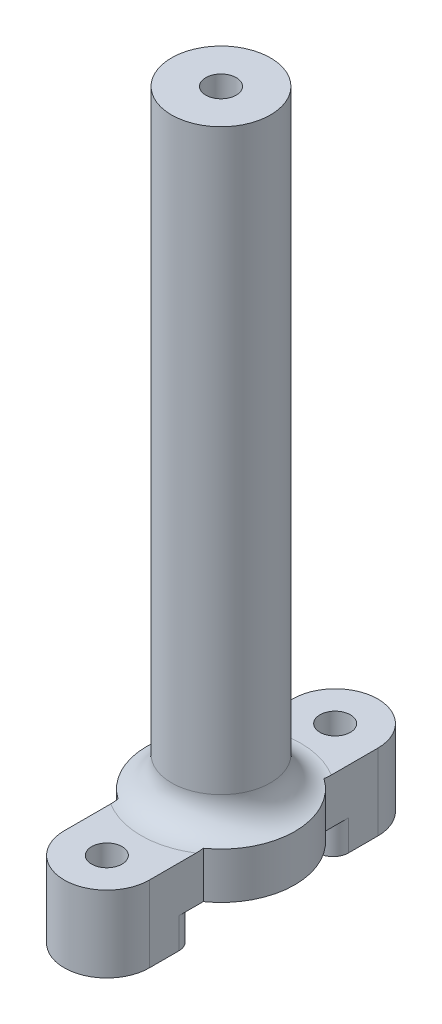
ISO-10303-21;
HEADER;
FILE_DESCRIPTION(('STEP AP214'),'2;1');
FILE_NAME('part.step','',(''),(''),'','','');
FILE_SCHEMA(('AUTOMOTIVE_DESIGN { 1 0 10303 214 1 1 1 1 }'));
ENDSEC;
DATA;
#1=APPLICATION_CONTEXT('core data for automotive mechanical design processes');
#2=APPLICATION_PROTOCOL_DEFINITION('international standard','automotive_design',2000,#1);
#3=PRODUCT_CONTEXT('',#1,'mechanical');
#4=PRODUCT('Part','Part','',(#3));
#5=PRODUCT_RELATED_PRODUCT_CATEGORY('part','',(#4));
#6=PRODUCT_DEFINITION_FORMATION('','',#4);
#7=PRODUCT_DEFINITION_CONTEXT('part definition',#1,'design');
#8=PRODUCT_DEFINITION('design','',#6,#7);
#9=PRODUCT_DEFINITION_SHAPE('','',#8);
#10=(LENGTH_UNIT() NAMED_UNIT(*) SI_UNIT(.MILLI.,.METRE.));
#11=(NAMED_UNIT(*) PLANE_ANGLE_UNIT() SI_UNIT($,.RADIAN.));
#12=(NAMED_UNIT(*) SI_UNIT($,.STERADIAN.) SOLID_ANGLE_UNIT());
#13=UNCERTAINTY_MEASURE_WITH_UNIT(LENGTH_MEASURE(1.E-05),#10,'distance_accuracy_value','');
#14=(GEOMETRIC_REPRESENTATION_CONTEXT(3) GLOBAL_UNCERTAINTY_ASSIGNED_CONTEXT((#13)) GLOBAL_UNIT_ASSIGNED_CONTEXT((#10,
#11,#12)) REPRESENTATION_CONTEXT('',''));
#15=CARTESIAN_POINT('',(0.,0.,0.));
#16=DIRECTION('',(0.,0.,1.));
#17=DIRECTION('',(1.,0.,0.));
#18=AXIS2_PLACEMENT_3D('',#15,#16,#17);
#19=CARTESIAN_POINT('',(0.,5.,0.));
#20=DIRECTION('',(0.,1.,0.));
#21=DIRECTION('',(0.,0.,1.));
#22=AXIS2_PLACEMENT_3D('',#19,#20,#21);
#23=PLANE('',#22);
#24=CARTESIAN_POINT('',(0.,5.,7.5));
#25=DIRECTION('',(0.,1.,0.));
#26=DIRECTION('',(0.,0.,1.));
#27=AXIS2_PLACEMENT_3D('',#24,#25,#26);
#28=CIRCLE('',#27,1.);
#29=CARTESIAN_POINT('',(0.,5.,8.5));
#30=VERTEX_POINT('',#29);
#31=EDGE_CURVE('E334',#30,#30,#28,.T.);
#32=ORIENTED_EDGE('',*,*,#31,.F.);
#33=EDGE_LOOP('',(#32));
#34=FACE_BOUND('',#33,.T.);
#35=DIRECTION('',(0.,0.,-1.));
#36=VECTOR('',#35,1.);
#37=CARTESIAN_POINT('',(2.8,5.,0.));
#38=LINE('',#37,#36);
#39=CARTESIAN_POINT('',(2.8,5.,7.5));
#40=VERTEX_POINT('',#39);
#41=CARTESIAN_POINT('',(2.8,5.,4.44100213915733));
#42=VERTEX_POINT('',#41);
#43=EDGE_CURVE('E434',#40,#42,#38,.T.);
#44=ORIENTED_EDGE('',*,*,#43,.T.);
#45=CARTESIAN_POINT('',(0.,5.,0.));
#46=DIRECTION('',(0.,1.,0.));
#47=DIRECTION('',(0.,0.,1.));
#48=AXIS2_PLACEMENT_3D('',#45,#46,#47);
#49=CIRCLE('',#48,5.25);
#50=CARTESIAN_POINT('',(-2.8,5.,4.44100213915733));
#51=VERTEX_POINT('',#50);
#52=EDGE_CURVE('E253',#42,#51,#49,.F.);
#53=ORIENTED_EDGE('',*,*,#52,.T.);
#54=DIRECTION('',(0.,0.,1.));
#55=VECTOR('',#54,1.);
#56=CARTESIAN_POINT('',(-2.8,5.,0.));
#57=LINE('',#56,#55);
#58=CARTESIAN_POINT('',(-2.8,5.,7.5));
#59=VERTEX_POINT('',#58);
#60=EDGE_CURVE('E360',#51,#59,#57,.T.);
#61=ORIENTED_EDGE('',*,*,#60,.T.);
#62=CARTESIAN_POINT('',(0.,5.,7.5));
#63=DIRECTION('',(0.,1.,0.));
#64=DIRECTION('',(0.,0.,1.));
#65=AXIS2_PLACEMENT_3D('',#62,#63,#64);
#66=CIRCLE('',#65,2.8);
#67=EDGE_CURVE('E485',#59,#40,#66,.T.);
#68=ORIENTED_EDGE('',*,*,#67,.T.);
#69=EDGE_LOOP('',(#44,#53,#61,#68));
#70=FACE_BOUND('',#69,.T.);
#71=ADVANCED_FACE('F44',(#34,#70),#23,.T.);
#72=CARTESIAN_POINT('',(0.,5.,0.));
#73=DIRECTION('',(0.,-1.,0.));
#74=DIRECTION('',(0.,0.,-1.));
#75=AXIS2_PLACEMENT_3D('',#72,#73,#74);
#76=CYLINDRICAL_SURFACE('',#75,4.8540226135977);
#77=CARTESIAN_POINT('',(0.,2.,0.));
#78=DIRECTION('',(0.,-1.,0.));
#79=DIRECTION('',(0.,0.,-1.));
#80=AXIS2_PLACEMENT_3D('',#77,#78,#79);
#81=CIRCLE('',#80,4.8540226135977);
#82=CARTESIAN_POINT('',(2.8,2.,-3.96503915911531));
#83=VERTEX_POINT('',#82);
#84=CARTESIAN_POINT('',(2.8,2.,3.96503915911531));
#85=VERTEX_POINT('',#84);
#86=EDGE_CURVE('E183',#83,#85,#81,.T.);
#87=ORIENTED_EDGE('',*,*,#86,.F.);
#88=DIRECTION('',(0.,-1.,0.));
#89=VECTOR('',#88,1.);
#90=CARTESIAN_POINT('',(2.8,5.,-3.96503915911531));
#91=LINE('',#90,#89);
#92=CARTESIAN_POINT('',(2.8,5.03959139221998,-3.96503915911531));
#93=VERTEX_POINT('',#92);
#94=EDGE_CURVE('E71',#93,#83,#91,.T.);
#95=ORIENTED_EDGE('',*,*,#94,.F.);
#96=CARTESIAN_POINT('',(0.,5.03959139221998,0.));
#97=DIRECTION('',(0.,1.,0.));
#98=DIRECTION('',(0.,0.,1.));
#99=AXIS2_PLACEMENT_3D('',#96,#97,#98);
#100=CIRCLE('',#99,4.8540226135977);
#101=CARTESIAN_POINT('',(2.8,5.03959139221998,3.96503915911531));
#102=VERTEX_POINT('',#101);
#103=EDGE_CURVE('E58',#93,#102,#100,.F.);
#104=ORIENTED_EDGE('',*,*,#103,.T.);
#105=DIRECTION('',(0.,-1.,0.));
#106=VECTOR('',#105,1.);
#107=CARTESIAN_POINT('',(2.8,5.,3.96503915911531));
#108=LINE('',#107,#106);
#109=EDGE_CURVE('E64',#102,#85,#108,.T.);
#110=ORIENTED_EDGE('',*,*,#109,.T.);
#111=EDGE_LOOP('',(#87,#95,#104,#110));
#112=FACE_BOUND('',#111,.T.);
#113=ADVANCED_FACE('F191',(#112),#76,.T.);
#114=CARTESIAN_POINT('',(0.,5.,0.));
#115=DIRECTION('',(0.,-1.,0.));
#116=DIRECTION('',(0.,0.,-1.));
#117=AXIS2_PLACEMENT_3D('',#114,#115,#116);
#118=CYLINDRICAL_SURFACE('',#117,4.8540226135977);
#119=CARTESIAN_POINT('',(-2.8,2.,3.96503915911531));
#120=VERTEX_POINT('',#119);
#121=CARTESIAN_POINT('',(-2.8,2.,-3.96503915911531));
#122=VERTEX_POINT('',#121);
#123=EDGE_CURVE('E190',#120,#122,#81,.T.);
#124=ORIENTED_EDGE('',*,*,#123,.F.);
#125=DIRECTION('',(0.,-1.,0.));
#126=VECTOR('',#125,1.);
#127=CARTESIAN_POINT('',(-2.8,5.,3.96503915911531));
#128=LINE('',#127,#126);
#129=CARTESIAN_POINT('',(-2.8,5.03959139221998,3.96503915911531));
#130=VERTEX_POINT('',#129);
#131=EDGE_CURVE('E333',#130,#120,#128,.T.);
#132=ORIENTED_EDGE('',*,*,#131,.F.);
#133=CARTESIAN_POINT('',(0.,5.03959139221998,0.));
#134=DIRECTION('',(0.,1.,0.));
#135=DIRECTION('',(0.,0.,1.));
#136=AXIS2_PLACEMENT_3D('',#133,#134,#135);
#137=CIRCLE('',#136,4.8540226135977);
#138=CARTESIAN_POINT('',(-2.8,5.03959139221998,-3.96503915911531));
#139=VERTEX_POINT('',#138);
#140=EDGE_CURVE('E264',#130,#139,#137,.F.);
#141=ORIENTED_EDGE('',*,*,#140,.T.);
#142=DIRECTION('',(0.,-1.,0.));
#143=VECTOR('',#142,1.);
#144=CARTESIAN_POINT('',(-2.8,5.,-3.96503915911531));
#145=LINE('',#144,#143);
#146=EDGE_CURVE('E337',#139,#122,#145,.T.);
#147=ORIENTED_EDGE('',*,*,#146,.T.);
#148=EDGE_LOOP('',(#124,#132,#141,#147));
#149=FACE_BOUND('',#148,.T.);
#150=ADVANCED_FACE('F305',(#149),#118,.T.);
#151=CARTESIAN_POINT('',(0.,0.,0.));
#152=DIRECTION('',(0.,1.,0.));
#153=DIRECTION('',(0.,0.,1.));
#154=AXIS2_PLACEMENT_3D('',#151,#152,#153);
#155=PLANE('',#154);
#156=CARTESIAN_POINT('',(0.,0.,-7.5));
#157=DIRECTION('',(0.,1.,0.));
#158=DIRECTION('',(0.,0.,1.));
#159=AXIS2_PLACEMENT_3D('',#156,#157,#158);
#160=CIRCLE('',#159,1.);
#161=CARTESIAN_POINT('',(0.,0.,-6.5));
#162=VERTEX_POINT('',#161);
#163=EDGE_CURVE('E358',#162,#162,#160,.T.);
#164=ORIENTED_EDGE('',*,*,#163,.T.);
#165=EDGE_LOOP('',(#164));
#166=FACE_BOUND('',#165,.T.);
#167=CARTESIAN_POINT('',(0.,0.,0.));
#168=DIRECTION('',(0.,1.,0.));
#169=DIRECTION('',(0.,0.,1.));
#170=AXIS2_PLACEMENT_3D('',#167,#168,#169);
#171=CIRCLE('',#170,4.8540226135977);
#172=CARTESIAN_POINT('',(1.4925191242311,0.,-4.61886589945219));
#173=VERTEX_POINT('',#172);
#174=CARTESIAN_POINT('',(-1.49251912423109,0.,-4.61886589945219));
#175=VERTEX_POINT('',#174);
#176=EDGE_CURVE('E208',#173,#175,#171,.T.);
#177=ORIENTED_EDGE('',*,*,#176,.T.);
#178=CARTESIAN_POINT('',(-1.8,0.,-5.57042016014172));
#179=DIRECTION('',(0.,1.,0.));
#180=DIRECTION('',(0.,0.,1.));
#181=AXIS2_PLACEMENT_3D('',#178,#179,#180);
#182=CIRCLE('',#181,1.);
#183=CARTESIAN_POINT('',(-2.8,0.,-5.57042016014172));
#184=VERTEX_POINT('',#183);
#185=EDGE_CURVE('E220',#175,#184,#182,.F.);
#186=ORIENTED_EDGE('',*,*,#185,.T.);
#187=DIRECTION('',(0.,0.,1.));
#188=VECTOR('',#187,1.);
#189=CARTESIAN_POINT('',(-2.8,0.,0.));
#190=LINE('',#189,#188);
#191=CARTESIAN_POINT('',(-2.8,0.,-7.5));
#192=VERTEX_POINT('',#191);
#193=EDGE_CURVE('E352',#192,#184,#190,.T.);
#194=ORIENTED_EDGE('',*,*,#193,.F.);
#195=CARTESIAN_POINT('',(0.,0.,-7.5));
#196=DIRECTION('',(0.,1.,0.));
#197=DIRECTION('',(0.,0.,1.));
#198=AXIS2_PLACEMENT_3D('',#195,#196,#197);
#199=CIRCLE('',#198,2.8);
#200=CARTESIAN_POINT('',(2.8,0.,-7.5));
#201=VERTEX_POINT('',#200);
#202=EDGE_CURVE('E350',#201,#192,#199,.T.);
#203=ORIENTED_EDGE('',*,*,#202,.F.);
#204=DIRECTION('',(0.,0.,-1.));
#205=VECTOR('',#204,1.);
#206=CARTESIAN_POINT('',(2.8,0.,0.));
#207=LINE('',#206,#205);
#208=CARTESIAN_POINT('',(2.8,0.,-5.57042016014172));
#209=VERTEX_POINT('',#208);
#210=EDGE_CURVE('E348',#209,#201,#207,.T.);
#211=ORIENTED_EDGE('',*,*,#210,.F.);
#212=CARTESIAN_POINT('',(1.8,0.,-5.57042016014172));
#213=DIRECTION('',(0.,1.,0.));
#214=DIRECTION('',(0.,0.,1.));
#215=AXIS2_PLACEMENT_3D('',#212,#213,#214);
#216=CIRCLE('',#215,1.);
#217=EDGE_CURVE('E218',#209,#173,#216,.F.);
#218=ORIENTED_EDGE('',*,*,#217,.T.);
#219=EDGE_LOOP('',(#177,#186,#194,#203,#211,#218));
#220=FACE_BOUND('',#219,.T.);
#221=ADVANCED_FACE('F272',(#166,#220),#155,.F.);
#222=CARTESIAN_POINT('',(-2.8,5.,0.));
#223=DIRECTION('',(1.,0.,0.));
#224=DIRECTION('',(0.,0.,-1.));
#225=AXIS2_PLACEMENT_3D('',#222,#223,#224);
#226=PLANE('',#225);
#227=DIRECTION('',(0.,0.,1.));
#228=VECTOR('',#227,1.);
#229=CARTESIAN_POINT('',(-2.8,2.,0.));
#230=LINE('',#229,#228);
#231=CARTESIAN_POINT('',(-2.8,2.,5.57042016014172));
#232=VERTEX_POINT('',#231);
#233=EDGE_CURVE('E226',#120,#232,#230,.T.);
#234=ORIENTED_EDGE('',*,*,#233,.T.);
#235=DIRECTION('',(0.,-1.,0.));
#236=VECTOR('',#235,1.);
#237=CARTESIAN_POINT('',(-2.8,5.,5.57042016014172));
#238=LINE('',#237,#236);
#239=CARTESIAN_POINT('',(-2.8,0.,5.57042016014172));
#240=VERTEX_POINT('',#239);
#241=EDGE_CURVE('E229',#232,#240,#238,.T.);
#242=ORIENTED_EDGE('',*,*,#241,.T.);
#243=DIRECTION('',(0.,0.,1.));
#244=VECTOR('',#243,1.);
#245=CARTESIAN_POINT('',(-2.8,0.,0.));
#246=LINE('',#245,#244);
#247=CARTESIAN_POINT('',(-2.8,0.,7.5));
#248=VERTEX_POINT('',#247);
#249=EDGE_CURVE('E187',#240,#248,#246,.T.);
#250=ORIENTED_EDGE('',*,*,#249,.T.);
#251=DIRECTION('',(0.,-1.,0.));
#252=VECTOR('',#251,1.);
#253=CARTESIAN_POINT('',(-2.8,5.,7.5));
#254=LINE('',#253,#252);
#255=EDGE_CURVE('E197',#59,#248,#254,.T.);
#256=ORIENTED_EDGE('',*,*,#255,.F.);
#257=ORIENTED_EDGE('',*,*,#60,.F.);
#258=CARTESIAN_POINT('',(-2.8,5.,4.44100213915733));
#259=CARTESIAN_POINT('',(-2.8,4.99999972473715,4.40112127625093));
#260=CARTESIAN_POINT('',(-2.8,5.00085353452332,4.36124212926071));
#261=CARTESIAN_POINT('',(-2.8,5.00422503449042,4.28162058867826));
#262=CARTESIAN_POINT('',(-2.8,5.00673994781963,4.24187807793606));
#263=CARTESIAN_POINT('',(-2.8,5.01338937938842,4.16253285707633));
#264=CARTESIAN_POINT('',(-2.8,5.01752376813749,4.12293013603685));
#265=CARTESIAN_POINT('',(-2.8,5.02737761982179,4.04385496878705));
#266=CARTESIAN_POINT('',(-2.8,5.03309971850042,4.00438285061713));
#267=CARTESIAN_POINT('',(-2.8,5.03959139221998,3.96503915911531));
#268=B_SPLINE_CURVE_WITH_KNOTS('',3,(#258,#259,#260,#261,#262,#263,#264,#265,#266,#267),
.UNSPECIFIED.,.F.,.F.,(4,2,2,2,4),(0.,0.119630981907788,0.239062482231952,0.358484434964734,
0.478105837551733),.UNSPECIFIED.);
#269=EDGE_CURVE('E256',#51,#130,#268,.T.);
#270=ORIENTED_EDGE('',*,*,#269,.T.);
#271=ORIENTED_EDGE('',*,*,#131,.T.);
#272=EDGE_LOOP('',(#234,#242,#250,#256,#257,#270,#271));
#273=FACE_BOUND('',#272,.T.);
#274=ADVANCED_FACE('F266',(#273),#226,.F.);
#275=CARTESIAN_POINT('',(0.,5.,7.5));
#276=DIRECTION('',(0.,-1.,0.));
#277=DIRECTION('',(0.,0.,-1.));
#278=AXIS2_PLACEMENT_3D('',#275,#276,#277);
#279=CYLINDRICAL_SURFACE('',#278,2.8);
#280=CARTESIAN_POINT('',(0.,0.,7.5));
#281=DIRECTION('',(0.,1.,0.));
#282=DIRECTION('',(0.,0.,1.));
#283=AXIS2_PLACEMENT_3D('',#280,#281,#282);
#284=CIRCLE('',#283,2.8);
#285=CARTESIAN_POINT('',(2.8,0.,7.5));
#286=VERTEX_POINT('',#285);
#287=EDGE_CURVE('E344',#248,#286,#284,.T.);
#288=ORIENTED_EDGE('',*,*,#287,.T.);
#289=DIRECTION('',(0.,-1.,0.));
#290=VECTOR('',#289,1.);
#291=CARTESIAN_POINT('',(2.8,5.,7.5));
#292=LINE('',#291,#290);
#293=EDGE_CURVE('E194',#40,#286,#292,.T.);
#294=ORIENTED_EDGE('',*,*,#293,.F.);
#295=ORIENTED_EDGE('',*,*,#67,.F.);
#296=ORIENTED_EDGE('',*,*,#255,.T.);
#297=EDGE_LOOP('',(#288,#294,#295,#296));
#298=FACE_BOUND('',#297,.T.);
#299=ADVANCED_FACE('F271',(#298),#279,.T.);
#300=CARTESIAN_POINT('',(2.8,5.,0.));
#301=DIRECTION('',(-1.,0.,0.));
#302=DIRECTION('',(0.,0.,1.));
#303=AXIS2_PLACEMENT_3D('',#300,#301,#302);
#304=PLANE('',#303);
#305=DIRECTION('',(0.,0.,-1.));
#306=VECTOR('',#305,1.);
#307=CARTESIAN_POINT('',(2.8,0.,0.));
#308=LINE('',#307,#306);
#309=CARTESIAN_POINT('',(2.8,0.,5.57042016014172));
#310=VERTEX_POINT('',#309);
#311=EDGE_CURVE('E346',#286,#310,#308,.T.);
#312=ORIENTED_EDGE('',*,*,#311,.T.);
#313=DIRECTION('',(0.,-1.,0.));
#314=VECTOR('',#313,1.);
#315=CARTESIAN_POINT('',(2.8,5.,5.57042016014172));
#316=LINE('',#315,#314);
#317=CARTESIAN_POINT('',(2.8,2.,5.57042016014172));
#318=VERTEX_POINT('',#317);
#319=EDGE_CURVE('E179',#310,#318,#316,.F.);
#320=ORIENTED_EDGE('',*,*,#319,.T.);
#321=DIRECTION('',(0.,0.,-1.));
#322=VECTOR('',#321,1.);
#323=CARTESIAN_POINT('',(2.8,2.,0.));
#324=LINE('',#323,#322);
#325=EDGE_CURVE('E174',#318,#85,#324,.T.);
#326=ORIENTED_EDGE('',*,*,#325,.T.);
#327=ORIENTED_EDGE('',*,*,#109,.F.);
#328=CARTESIAN_POINT('',(2.8,5.03959139221998,3.96503915911531));
#329=CARTESIAN_POINT('',(2.8,5.03309971850042,4.00438285061713));
#330=CARTESIAN_POINT('',(2.8,5.02737761982179,4.04385496878705));
#331=CARTESIAN_POINT('',(2.8,5.01752376813749,4.12293013603685));
#332=CARTESIAN_POINT('',(2.8,5.01338937938842,4.16253285707633));
#333=CARTESIAN_POINT('',(2.8,5.00673994781963,4.24187807793606));
#334=CARTESIAN_POINT('',(2.8,5.00422503449042,4.28162058867826));
#335=CARTESIAN_POINT('',(2.8,5.00085353452331,4.36124212926071));
#336=CARTESIAN_POINT('',(2.8,4.99999972473715,4.40112127625093));
#337=CARTESIAN_POINT('',(2.8,5.,4.44100213915733));
#338=B_SPLINE_CURVE_WITH_KNOTS('',3,(#328,#329,#330,#331,#332,#333,#334,#335,#336,#337),
.UNSPECIFIED.,.F.,.F.,(4,2,2,2,4),(0.,0.119621402586998,0.23904335531978,0.358474855643944,
0.478105837551731),.UNSPECIFIED.);
#339=EDGE_CURVE('E11',#102,#42,#338,.T.);
#340=ORIENTED_EDGE('',*,*,#339,.T.);
#341=ORIENTED_EDGE('',*,*,#43,.F.);
#342=ORIENTED_EDGE('',*,*,#293,.T.);
#343=EDGE_LOOP('',(#312,#320,#326,#327,#340,#341,#342));
#344=FACE_BOUND('',#343,.T.);
#345=ADVANCED_FACE('F177',(#344),#304,.F.);
#346=CARTESIAN_POINT('',(2.8,5.,0.));
#347=DIRECTION('',(-1.,0.,0.));
#348=DIRECTION('',(0.,0.,1.));
#349=AXIS2_PLACEMENT_3D('',#346,#347,#348);
#350=PLANE('',#349);
#351=DIRECTION('',(0.,0.,-1.));
#352=VECTOR('',#351,1.);
#353=CARTESIAN_POINT('',(2.8,2.,0.));
#354=LINE('',#353,#352);
#355=CARTESIAN_POINT('',(2.8,2.,-5.57042016014172));
#356=VERTEX_POINT('',#355);
#357=EDGE_CURVE('E186',#83,#356,#354,.T.);
#358=ORIENTED_EDGE('',*,*,#357,.T.);
#359=DIRECTION('',(0.,-1.,0.));
#360=VECTOR('',#359,1.);
#361=CARTESIAN_POINT('',(2.8,5.,-5.57042016014172));
#362=LINE('',#361,#360);
#363=EDGE_CURVE('E223',#356,#209,#362,.T.);
#364=ORIENTED_EDGE('',*,*,#363,.T.);
#365=ORIENTED_EDGE('',*,*,#210,.T.);
#366=DIRECTION('',(0.,-1.,0.));
#367=VECTOR('',#366,1.);
#368=CARTESIAN_POINT('',(2.8,5.,-7.5));
#369=LINE('',#368,#367);
#370=CARTESIAN_POINT('',(2.8,5.,-7.5));
#371=VERTEX_POINT('',#370);
#372=EDGE_CURVE('E199',#371,#201,#369,.T.);
#373=ORIENTED_EDGE('',*,*,#372,.F.);
#374=DIRECTION('',(0.,0.,-1.));
#375=VECTOR('',#374,1.);
#376=CARTESIAN_POINT('',(2.8,5.,0.));
#377=LINE('',#376,#375);
#378=CARTESIAN_POINT('',(2.8,5.,-4.44100213915733));
#379=VERTEX_POINT('',#378);
#380=EDGE_CURVE('E482',#379,#371,#377,.T.);
#381=ORIENTED_EDGE('',*,*,#380,.F.);
#382=CARTESIAN_POINT('',(2.8,5.,-4.44100213915733));
#383=CARTESIAN_POINT('',(2.8,4.99999972473715,-4.40112127625093));
#384=CARTESIAN_POINT('',(2.8,5.00085353452332,-4.36124212926071));
#385=CARTESIAN_POINT('',(2.8,5.00422503449042,-4.28162058867827));
#386=CARTESIAN_POINT('',(2.8,5.00673994781963,-4.24187807793606));
#387=CARTESIAN_POINT('',(2.8,5.01338937938842,-4.16253285707633));
#388=CARTESIAN_POINT('',(2.8,5.01752376813749,-4.12293013603685));
#389=CARTESIAN_POINT('',(2.8,5.02737761982179,-4.04385496878705));
#390=CARTESIAN_POINT('',(2.8,5.03309971850042,-4.00438285061713));
#391=CARTESIAN_POINT('',(2.8,5.03959139221998,-3.96503915911531));
#392=B_SPLINE_CURVE_WITH_KNOTS('',3,(#382,#383,#384,#385,#386,#387,#388,#389,#390,#391),
.UNSPECIFIED.,.F.,.F.,(4,2,2,2,4),(0.,0.119630981907787,0.239062482231952,0.358484434964733,
0.478105837551732),.UNSPECIFIED.);
#393=EDGE_CURVE('E398',#379,#93,#392,.T.);
#394=ORIENTED_EDGE('',*,*,#393,.T.);
#395=ORIENTED_EDGE('',*,*,#94,.T.);
#396=EDGE_LOOP('',(#358,#364,#365,#373,#381,#394,#395));
#397=FACE_BOUND('',#396,.T.);
#398=ADVANCED_FACE('F415',(#397),#350,.F.);
#399=CARTESIAN_POINT('',(0.,5.,-7.5));
#400=DIRECTION('',(0.,-1.,0.));
#401=DIRECTION('',(0.,0.,-1.));
#402=AXIS2_PLACEMENT_3D('',#399,#400,#401);
#403=CYLINDRICAL_SURFACE('',#402,2.8);
#404=ORIENTED_EDGE('',*,*,#202,.T.);
#405=DIRECTION('',(0.,-1.,0.));
#406=VECTOR('',#405,1.);
#407=CARTESIAN_POINT('',(-2.8,5.,-7.5));
#408=LINE('',#407,#406);
#409=CARTESIAN_POINT('',(-2.8,5.,-7.5));
#410=VERTEX_POINT('',#409);
#411=EDGE_CURVE('E364',#410,#192,#408,.T.);
#412=ORIENTED_EDGE('',*,*,#411,.F.);
#413=CARTESIAN_POINT('',(0.,5.,-7.5));
#414=DIRECTION('',(0.,1.,0.));
#415=DIRECTION('',(0.,0.,1.));
#416=AXIS2_PLACEMENT_3D('',#413,#414,#415);
#417=CIRCLE('',#416,2.8);
#418=EDGE_CURVE('E373',#371,#410,#417,.T.);
#419=ORIENTED_EDGE('',*,*,#418,.F.);
#420=ORIENTED_EDGE('',*,*,#372,.T.);
#421=EDGE_LOOP('',(#404,#412,#419,#420));
#422=FACE_BOUND('',#421,.T.);
#423=ADVANCED_FACE('F371',(#422),#403,.T.);
#424=CARTESIAN_POINT('',(-2.8,5.,0.));
#425=DIRECTION('',(1.,0.,0.));
#426=DIRECTION('',(0.,0.,-1.));
#427=AXIS2_PLACEMENT_3D('',#424,#425,#426);
#428=PLANE('',#427);
#429=ORIENTED_EDGE('',*,*,#193,.T.);
#430=DIRECTION('',(0.,-1.,0.));
#431=VECTOR('',#430,1.);
#432=CARTESIAN_POINT('',(-2.8,5.,-5.57042016014172));
#433=LINE('',#432,#431);
#434=CARTESIAN_POINT('',(-2.8,2.,-5.57042016014172));
#435=VERTEX_POINT('',#434);
#436=EDGE_CURVE('E211',#184,#435,#433,.F.);
#437=ORIENTED_EDGE('',*,*,#436,.T.);
#438=DIRECTION('',(0.,0.,1.));
#439=VECTOR('',#438,1.);
#440=CARTESIAN_POINT('',(-2.8,2.,0.));
#441=LINE('',#440,#439);
#442=EDGE_CURVE('E209',#435,#122,#441,.T.);
#443=ORIENTED_EDGE('',*,*,#442,.T.);
#444=ORIENTED_EDGE('',*,*,#146,.F.);
#445=CARTESIAN_POINT('',(-2.8,5.03959139221998,-3.96503915911531));
#446=CARTESIAN_POINT('',(-2.8,5.03309971850042,-4.00438285061713));
#447=CARTESIAN_POINT('',(-2.8,5.02737761982179,-4.04385496878705));
#448=CARTESIAN_POINT('',(-2.8,5.01752376813749,-4.12293013603685));
#449=CARTESIAN_POINT('',(-2.8,5.01338937938842,-4.16253285707633));
#450=CARTESIAN_POINT('',(-2.8,5.00673994781963,-4.24187807793606));
#451=CARTESIAN_POINT('',(-2.8,5.00422503449042,-4.28162058867827));
#452=CARTESIAN_POINT('',(-2.8,5.00085353452331,-4.36124212926071));
#453=CARTESIAN_POINT('',(-2.8,4.99999972473715,-4.40112127625093));
#454=CARTESIAN_POINT('',(-2.8,5.,-4.44100213915733));
#455=B_SPLINE_CURVE_WITH_KNOTS('',3,(#445,#446,#447,#448,#449,#450,#451,#452,#453,#454),
.UNSPECIFIED.,.F.,.F.,(4,2,2,2,4),(0.,0.119621402586998,0.23904335531978,0.358474855643944,
0.478105837551733),.UNSPECIFIED.);
#456=CARTESIAN_POINT('',(-2.8,5.,-4.44100213915733));
#457=VERTEX_POINT('',#456);
#458=EDGE_CURVE('E392',#139,#457,#455,.T.);
#459=ORIENTED_EDGE('',*,*,#458,.T.);
#460=DIRECTION('',(0.,0.,1.));
#461=VECTOR('',#460,1.);
#462=CARTESIAN_POINT('',(-2.8,5.,0.));
#463=LINE('',#462,#461);
#464=EDGE_CURVE('E328',#410,#457,#463,.T.);
#465=ORIENTED_EDGE('',*,*,#464,.F.);
#466=ORIENTED_EDGE('',*,*,#411,.T.);
#467=EDGE_LOOP('',(#429,#437,#443,#444,#459,#465,#466));
#468=FACE_BOUND('',#467,.T.);
#469=ADVANCED_FACE('F383',(#468),#428,.F.);
#470=CARTESIAN_POINT('',(0.,5.,7.5));
#471=DIRECTION('',(0.,-1.,0.));
#472=DIRECTION('',(0.,0.,-1.));
#473=AXIS2_PLACEMENT_3D('',#470,#471,#472);
#474=CYLINDRICAL_SURFACE('',#473,1.);
#475=ORIENTED_EDGE('',*,*,#31,.T.);
#476=EDGE_LOOP('',(#475));
#477=FACE_BOUND('',#476,.T.);
#478=CARTESIAN_POINT('',(0.,0.,7.5));
#479=DIRECTION('',(0.,1.,0.));
#480=DIRECTION('',(0.,0.,1.));
#481=AXIS2_PLACEMENT_3D('',#478,#479,#480);
#482=CIRCLE('',#481,1.);
#483=CARTESIAN_POINT('',(0.,0.,8.5));
#484=VERTEX_POINT('',#483);
#485=EDGE_CURVE('E355',#484,#484,#482,.T.);
#486=ORIENTED_EDGE('',*,*,#485,.F.);
#487=EDGE_LOOP('',(#486));
#488=FACE_BOUND('',#487,.T.);
#489=ADVANCED_FACE('F322',(#477,#488),#474,.F.);
#490=CARTESIAN_POINT('',(0.,5.,-7.5));
#491=DIRECTION('',(0.,-1.,0.));
#492=DIRECTION('',(0.,0.,-1.));
#493=AXIS2_PLACEMENT_3D('',#490,#491,#492);
#494=CYLINDRICAL_SURFACE('',#493,1.);
#495=CARTESIAN_POINT('',(0.,5.,-7.5));
#496=DIRECTION('',(0.,1.,0.));
#497=DIRECTION('',(0.,0.,1.));
#498=AXIS2_PLACEMENT_3D('',#495,#496,#497);
#499=CIRCLE('',#498,1.);
#500=CARTESIAN_POINT('',(0.,5.,-6.5));
#501=VERTEX_POINT('',#500);
#502=EDGE_CURVE('E332',#501,#501,#499,.T.);
#503=ORIENTED_EDGE('',*,*,#502,.T.);
#504=EDGE_LOOP('',(#503));
#505=FACE_BOUND('',#504,.T.);
#506=ORIENTED_EDGE('',*,*,#163,.F.);
#507=EDGE_LOOP('',(#506));
#508=FACE_BOUND('',#507,.T.);
#509=ADVANCED_FACE('F313',(#505,#508),#494,.F.);
#510=ORIENTED_EDGE('',*,*,#464,.T.);
#511=CARTESIAN_POINT('',(0.,5.,0.));
#512=DIRECTION('',(0.,1.,0.));
#513=DIRECTION('',(0.,0.,1.));
#514=AXIS2_PLACEMENT_3D('',#511,#512,#513);
#515=CIRCLE('',#514,5.25);
#516=EDGE_CURVE('E251',#457,#379,#515,.F.);
#517=ORIENTED_EDGE('',*,*,#516,.T.);
#518=ORIENTED_EDGE('',*,*,#380,.T.);
#519=ORIENTED_EDGE('',*,*,#418,.T.);
#520=EDGE_LOOP('',(#510,#517,#518,#519));
#521=FACE_BOUND('',#520,.T.);
#522=ORIENTED_EDGE('',*,*,#502,.F.);
#523=EDGE_LOOP('',(#522));
#524=FACE_BOUND('',#523,.T.);
#525=ADVANCED_FACE('F300',(#521,#524),#23,.T.);
#526=ORIENTED_EDGE('',*,*,#249,.F.);
#527=CARTESIAN_POINT('',(-1.8,0.,5.57042016014172));
#528=DIRECTION('',(0.,1.,0.));
#529=DIRECTION('',(0.,0.,1.));
#530=AXIS2_PLACEMENT_3D('',#527,#528,#529);
#531=CIRCLE('',#530,1.);
#532=CARTESIAN_POINT('',(-1.4925191242311,0.,4.61886589945219));
#533=VERTEX_POINT('',#532);
#534=EDGE_CURVE('E234',#240,#533,#531,.F.);
#535=ORIENTED_EDGE('',*,*,#534,.T.);
#536=CARTESIAN_POINT('',(1.4925191242311,0.,4.61886589945219));
#537=VERTEX_POINT('',#536);
#538=EDGE_CURVE('E205',#533,#537,#171,.T.);
#539=ORIENTED_EDGE('',*,*,#538,.T.);
#540=CARTESIAN_POINT('',(1.8,0.,5.57042016014172));
#541=DIRECTION('',(0.,1.,0.));
#542=DIRECTION('',(0.,0.,1.));
#543=AXIS2_PLACEMENT_3D('',#540,#541,#542);
#544=CIRCLE('',#543,1.);
#545=EDGE_CURVE('E232',#537,#310,#544,.F.);
#546=ORIENTED_EDGE('',*,*,#545,.T.);
#547=ORIENTED_EDGE('',*,*,#311,.F.);
#548=ORIENTED_EDGE('',*,*,#287,.F.);
#549=EDGE_LOOP('',(#526,#535,#539,#546,#547,#548));
#550=FACE_BOUND('',#549,.T.);
#551=ORIENTED_EDGE('',*,*,#485,.T.);
#552=EDGE_LOOP('',(#551));
#553=FACE_BOUND('',#552,.T.);
#554=ADVANCED_FACE('F312',(#550,#553),#155,.F.);
#555=CARTESIAN_POINT('',(0.,2.,0.));
#556=DIRECTION('',(0.,-1.,0.));
#557=DIRECTION('',(0.,0.,-1.));
#558=AXIS2_PLACEMENT_3D('',#555,#556,#557);
#559=CYLINDRICAL_SURFACE('',#558,4.8540226135977);
#560=ORIENTED_EDGE('',*,*,#538,.F.);
#561=DIRECTION('',(0.,-1.,0.));
#562=VECTOR('',#561,1.);
#563=CARTESIAN_POINT('',(-1.4925191242311,2.,4.61886589945219));
#564=LINE('',#563,#562);
#565=CARTESIAN_POINT('',(-1.4925191242311,2.,4.61886589945219));
#566=VERTEX_POINT('',#565);
#567=EDGE_CURVE('E181',#533,#566,#564,.F.);
#568=ORIENTED_EDGE('',*,*,#567,.T.);
#569=CARTESIAN_POINT('',(1.4925191242311,2.,4.61886589945219));
#570=VERTEX_POINT('',#569);
#571=EDGE_CURVE('E188',#570,#566,#81,.T.);
#572=ORIENTED_EDGE('',*,*,#571,.F.);
#573=DIRECTION('',(0.,-1.,0.));
#574=VECTOR('',#573,1.);
#575=CARTESIAN_POINT('',(1.4925191242311,2.,4.61886589945219));
#576=LINE('',#575,#574);
#577=EDGE_CURVE('E236',#570,#537,#576,.T.);
#578=ORIENTED_EDGE('',*,*,#577,.T.);
#579=EDGE_LOOP('',(#560,#568,#572,#578));
#580=FACE_BOUND('',#579,.T.);
#581=ADVANCED_FACE('F319',(#580),#559,.F.);
#582=CARTESIAN_POINT('',(-1.49251912423109,2.,-4.61886589945219));
#583=VERTEX_POINT('',#582);
#584=CARTESIAN_POINT('',(1.4925191242311,2.,-4.61886589945219));
#585=VERTEX_POINT('',#584);
#586=EDGE_CURVE('E443',#583,#585,#81,.T.);
#587=ORIENTED_EDGE('',*,*,#586,.F.);
#588=DIRECTION('',(0.,-1.,0.));
#589=VECTOR('',#588,1.);
#590=CARTESIAN_POINT('',(-1.49251912423109,2.,-4.61886589945219));
#591=LINE('',#590,#589);
#592=EDGE_CURVE('E216',#583,#175,#591,.T.);
#593=ORIENTED_EDGE('',*,*,#592,.T.);
#594=ORIENTED_EDGE('',*,*,#176,.F.);
#595=DIRECTION('',(0.,-1.,0.));
#596=VECTOR('',#595,1.);
#597=CARTESIAN_POINT('',(1.4925191242311,2.,-4.61886589945219));
#598=LINE('',#597,#596);
#599=EDGE_CURVE('E214',#173,#585,#598,.F.);
#600=ORIENTED_EDGE('',*,*,#599,.T.);
#601=EDGE_LOOP('',(#587,#593,#594,#600));
#602=FACE_BOUND('',#601,.T.);
#603=ADVANCED_FACE('F471',(#602),#559,.F.);
#604=CARTESIAN_POINT('',(0.,2.,0.));
#605=DIRECTION('',(0.,-1.,0.));
#606=DIRECTION('',(0.,0.,-1.));
#607=AXIS2_PLACEMENT_3D('',#604,#605,#606);
#608=PLANE('',#607);
#609=ORIENTED_EDGE('',*,*,#86,.T.);
#610=ORIENTED_EDGE('',*,*,#325,.F.);
#611=CARTESIAN_POINT('',(1.8,2.,5.57042016014172));
#612=DIRECTION('',(0.,-1.,0.));
#613=DIRECTION('',(0.,0.,-1.));
#614=AXIS2_PLACEMENT_3D('',#611,#612,#613);
#615=CIRCLE('',#614,1.);
#616=EDGE_CURVE('E246',#318,#570,#615,.F.);
#617=ORIENTED_EDGE('',*,*,#616,.T.);
#618=ORIENTED_EDGE('',*,*,#571,.T.);
#619=CARTESIAN_POINT('',(-1.8,2.,5.57042016014172));
#620=DIRECTION('',(0.,-1.,0.));
#621=DIRECTION('',(0.,0.,-1.));
#622=AXIS2_PLACEMENT_3D('',#619,#620,#621);
#623=CIRCLE('',#622,1.);
#624=EDGE_CURVE('E244',#566,#232,#623,.F.);
#625=ORIENTED_EDGE('',*,*,#624,.T.);
#626=ORIENTED_EDGE('',*,*,#233,.F.);
#627=ORIENTED_EDGE('',*,*,#123,.T.);
#628=ORIENTED_EDGE('',*,*,#442,.F.);
#629=CARTESIAN_POINT('',(-1.8,2.,-5.57042016014172));
#630=DIRECTION('',(0.,-1.,0.));
#631=DIRECTION('',(0.,0.,-1.));
#632=AXIS2_PLACEMENT_3D('',#629,#630,#631);
#633=CIRCLE('',#632,1.);
#634=EDGE_CURVE('E240',#435,#583,#633,.F.);
#635=ORIENTED_EDGE('',*,*,#634,.T.);
#636=ORIENTED_EDGE('',*,*,#586,.T.);
#637=CARTESIAN_POINT('',(1.8,2.,-5.57042016014172));
#638=DIRECTION('',(0.,-1.,0.));
#639=DIRECTION('',(0.,0.,-1.));
#640=AXIS2_PLACEMENT_3D('',#637,#638,#639);
#641=CIRCLE('',#640,1.);
#642=EDGE_CURVE('E242',#585,#356,#641,.F.);
#643=ORIENTED_EDGE('',*,*,#642,.T.);
#644=ORIENTED_EDGE('',*,*,#357,.F.);
#645=EDGE_LOOP('',(#609,#610,#617,#618,#625,#626,#627,#628,#635,#636,#643,#644));
#646=FACE_BOUND('',#645,.T.);
#647=ADVANCED_FACE('F184',(#646),#608,.T.);
#648=CARTESIAN_POINT('',(-1.8,2.,-5.57042016014172));
#649=DIRECTION('',(0.,-1.,0.));
#650=DIRECTION('',(0.,0.,-1.));
#651=AXIS2_PLACEMENT_3D('',#648,#649,#650);
#652=CYLINDRICAL_SURFACE('',#651,1.);
#653=ORIENTED_EDGE('',*,*,#185,.F.);
#654=ORIENTED_EDGE('',*,*,#592,.F.);
#655=ORIENTED_EDGE('',*,*,#634,.F.);
#656=ORIENTED_EDGE('',*,*,#436,.F.);
#657=EDGE_LOOP('',(#653,#654,#655,#656));
#658=FACE_BOUND('',#657,.T.);
#659=ADVANCED_FACE('F274',(#658),#652,.T.);
#660=CARTESIAN_POINT('',(1.8,2.,-5.57042016014172));
#661=DIRECTION('',(0.,-1.,0.));
#662=DIRECTION('',(0.,0.,-1.));
#663=AXIS2_PLACEMENT_3D('',#660,#661,#662);
#664=CYLINDRICAL_SURFACE('',#663,1.);
#665=ORIENTED_EDGE('',*,*,#642,.F.);
#666=ORIENTED_EDGE('',*,*,#599,.F.);
#667=ORIENTED_EDGE('',*,*,#217,.F.);
#668=ORIENTED_EDGE('',*,*,#363,.F.);
#669=EDGE_LOOP('',(#665,#666,#667,#668));
#670=FACE_BOUND('',#669,.T.);
#671=ADVANCED_FACE('F277',(#670),#664,.T.);
#672=CARTESIAN_POINT('',(-1.8,2.,5.57042016014172));
#673=DIRECTION('',(0.,-1.,0.));
#674=DIRECTION('',(0.,0.,-1.));
#675=AXIS2_PLACEMENT_3D('',#672,#673,#674);
#676=CYLINDRICAL_SURFACE('',#675,1.);
#677=ORIENTED_EDGE('',*,*,#624,.F.);
#678=ORIENTED_EDGE('',*,*,#567,.F.);
#679=ORIENTED_EDGE('',*,*,#534,.F.);
#680=ORIENTED_EDGE('',*,*,#241,.F.);
#681=EDGE_LOOP('',(#677,#678,#679,#680));
#682=FACE_BOUND('',#681,.T.);
#683=ADVANCED_FACE('F281',(#682),#676,.T.);
#684=CARTESIAN_POINT('',(1.8,2.,5.57042016014172));
#685=DIRECTION('',(0.,-1.,0.));
#686=DIRECTION('',(0.,0.,-1.));
#687=AXIS2_PLACEMENT_3D('',#684,#685,#686);
#688=CYLINDRICAL_SURFACE('',#687,1.);
#689=ORIENTED_EDGE('',*,*,#545,.F.);
#690=ORIENTED_EDGE('',*,*,#577,.F.);
#691=ORIENTED_EDGE('',*,*,#616,.F.);
#692=ORIENTED_EDGE('',*,*,#319,.F.);
#693=EDGE_LOOP('',(#689,#690,#691,#692));
#694=FACE_BOUND('',#693,.T.);
#695=ADVANCED_FACE('F284',(#694),#688,.T.);
#696=CARTESIAN_POINT('',(0.,45.,0.));
#697=DIRECTION('',(0.,-1.,0.));
#698=DIRECTION('',(0.,0.,-1.));
#699=AXIS2_PLACEMENT_3D('',#696,#697,#698);
#700=CYLINDRICAL_SURFACE('',#699,3.25);
#701=CARTESIAN_POINT('',(0.,7.,0.));
#702=DIRECTION('',(0.,1.,0.));
#703=DIRECTION('',(0.,0.,1.));
#704=AXIS2_PLACEMENT_3D('',#701,#702,#703);
#705=CIRCLE('',#704,3.25);
#706=CARTESIAN_POINT('',(0.,7.,3.25));
#707=VERTEX_POINT('',#706);
#708=EDGE_CURVE('E248',#707,#707,#705,.T.);
#709=ORIENTED_EDGE('',*,*,#708,.T.);
#710=EDGE_LOOP('',(#709));
#711=FACE_BOUND('',#710,.T.);
#712=CARTESIAN_POINT('',(0.,45.,0.));
#713=DIRECTION('',(0.,1.,0.));
#714=DIRECTION('',(0.,0.,1.));
#715=AXIS2_PLACEMENT_3D('',#712,#713,#714);
#716=CIRCLE('',#715,3.25);
#717=CARTESIAN_POINT('',(0.,45.,3.25));
#718=VERTEX_POINT('',#717);
#719=EDGE_CURVE('E446',#718,#718,#716,.T.);
#720=ORIENTED_EDGE('',*,*,#719,.F.);
#721=EDGE_LOOP('',(#720));
#722=FACE_BOUND('',#721,.T.);
#723=ADVANCED_FACE('F287',(#711,#722),#700,.T.);
#724=CARTESIAN_POINT('',(0.,45.,0.));
#725=DIRECTION('',(0.,1.,0.));
#726=DIRECTION('',(0.,0.,1.));
#727=AXIS2_PLACEMENT_3D('',#724,#725,#726);
#728=PLANE('',#727);
#729=CARTESIAN_POINT('',(0.,45.,0.));
#730=DIRECTION('',(0.,1.,0.));
#731=DIRECTION('',(0.,0.,1.));
#732=AXIS2_PLACEMENT_3D('',#729,#730,#731);
#733=CIRCLE('',#732,1.);
#734=CARTESIAN_POINT('',(0.,45.,1.));
#735=VERTEX_POINT('',#734);
#736=EDGE_CURVE('E453',#735,#735,#733,.T.);
#737=ORIENTED_EDGE('',*,*,#736,.F.);
#738=EDGE_LOOP('',(#737));
#739=FACE_BOUND('',#738,.T.);
#740=ORIENTED_EDGE('',*,*,#719,.T.);
#741=EDGE_LOOP('',(#740));
#742=FACE_BOUND('',#741,.T.);
#743=ADVANCED_FACE('F293',(#739,#742),#728,.T.);
#744=CARTESIAN_POINT('',(0.,40.,0.));
#745=DIRECTION('',(0.,1.,0.));
#746=DIRECTION('',(0.,0.,1.));
#747=AXIS2_PLACEMENT_3D('',#744,#745,#746);
#748=CYLINDRICAL_SURFACE('',#747,1.);
#749=CARTESIAN_POINT('',(0.,40.,0.));
#750=DIRECTION('',(0.,1.,0.));
#751=DIRECTION('',(0.,0.,1.));
#752=AXIS2_PLACEMENT_3D('',#749,#750,#751);
#753=CIRCLE('',#752,1.);
#754=CARTESIAN_POINT('',(0.,40.,1.));
#755=VERTEX_POINT('',#754);
#756=EDGE_CURVE('E449',#755,#755,#753,.T.);
#757=ORIENTED_EDGE('',*,*,#756,.F.);
#758=EDGE_LOOP('',(#757));
#759=FACE_BOUND('',#758,.T.);
#760=ORIENTED_EDGE('',*,*,#736,.T.);
#761=EDGE_LOOP('',(#760));
#762=FACE_BOUND('',#761,.T.);
#763=ADVANCED_FACE('F459',(#759,#762),#748,.F.);
#764=CARTESIAN_POINT('',(0.,40.,0.));
#765=DIRECTION('',(0.,1.,0.));
#766=DIRECTION('',(0.,0.,1.));
#767=AXIS2_PLACEMENT_3D('',#764,#765,#766);
#768=PLANE('',#767);
#769=ORIENTED_EDGE('',*,*,#756,.T.);
#770=EDGE_LOOP('',(#769));
#771=FACE_BOUND('',#770,.T.);
#772=ADVANCED_FACE('F465',(#771),#768,.T.);
#773=CARTESIAN_POINT('',(0.,7.,0.));
#774=DIRECTION('',(0.,1.,0.));
#775=DIRECTION('',(0.,0.,1.));
#776=AXIS2_PLACEMENT_3D('',#773,#774,#775);
#777=TOROIDAL_SURFACE('',#776,5.25,2.);
#778=ORIENTED_EDGE('',*,*,#269,.F.);
#779=ORIENTED_EDGE('',*,*,#52,.F.);
#780=ORIENTED_EDGE('',*,*,#339,.F.);
#781=ORIENTED_EDGE('',*,*,#103,.F.);
#782=ORIENTED_EDGE('',*,*,#393,.F.);
#783=ORIENTED_EDGE('',*,*,#516,.F.);
#784=ORIENTED_EDGE('',*,*,#458,.F.);
#785=ORIENTED_EDGE('',*,*,#140,.F.);
#786=EDGE_LOOP('',(#778,#779,#780,#781,#782,#783,#784,#785));
#787=FACE_BOUND('',#786,.T.);
#788=ORIENTED_EDGE('',*,*,#708,.F.);
#789=EDGE_LOOP('',(#788));
#790=FACE_BOUND('',#789,.T.);
#791=ADVANCED_FACE('F46',(#787,#790),#777,.F.);
#792=CLOSED_SHELL('',(#71,#113,#150,#221,#274,#299,#345,#398,#423,#469,#489,#509,#525,#554,#581,
#603,#647,#659,#671,#683,#695,#723,#743,#763,#772,#791));
#793=MANIFOLD_SOLID_BREP('B2',#792);
#794=ADVANCED_BREP_SHAPE_REPRESENTATION('',(#18,#793),#14);
#795=SHAPE_DEFINITION_REPRESENTATION(#9,#794);
ENDSEC;
END-ISO-10303-21;
